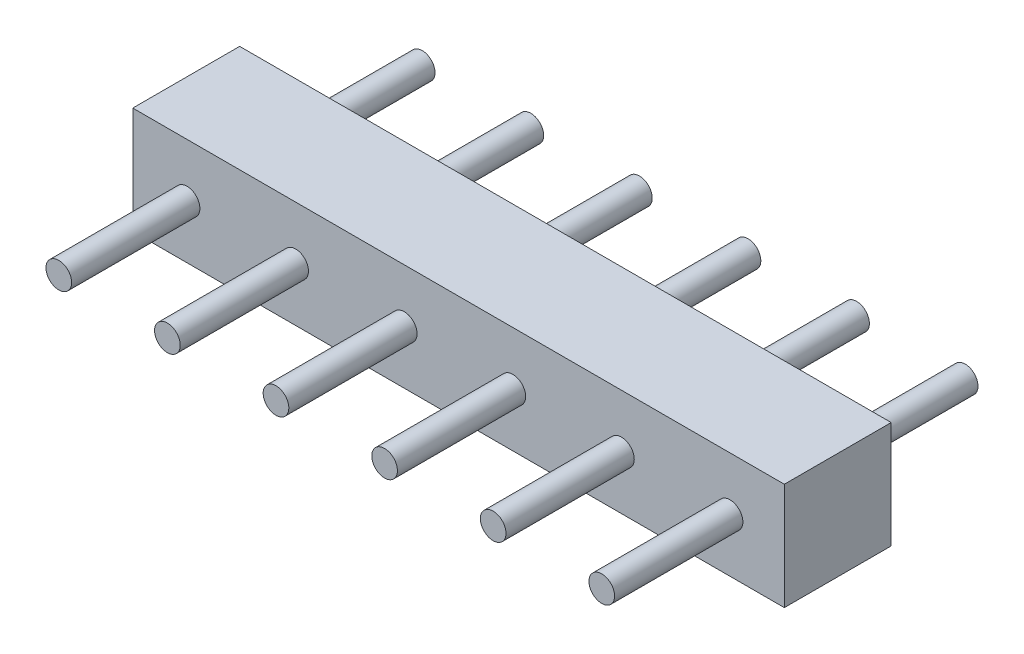
ISO-10303-21;
HEADER;
FILE_DESCRIPTION(('STEP AP214'),'2;1');
FILE_NAME('part.step','',(''),(''),'','','');
FILE_SCHEMA(('AUTOMOTIVE_DESIGN { 1 0 10303 214 1 1 1 1 }'));
ENDSEC;
DATA;
#1=APPLICATION_CONTEXT('core data for automotive mechanical design processes');
#2=APPLICATION_PROTOCOL_DEFINITION('international standard','automotive_design',2000,#1);
#3=PRODUCT_CONTEXT('',#1,'mechanical');
#4=PRODUCT('Part','Part','',(#3));
#5=PRODUCT_RELATED_PRODUCT_CATEGORY('part','',(#4));
#6=PRODUCT_DEFINITION_FORMATION('','',#4);
#7=PRODUCT_DEFINITION_CONTEXT('part definition',#1,'design');
#8=PRODUCT_DEFINITION('design','',#6,#7);
#9=PRODUCT_DEFINITION_SHAPE('','',#8);
#10=(LENGTH_UNIT() NAMED_UNIT(*) SI_UNIT(.MILLI.,.METRE.));
#11=(NAMED_UNIT(*) PLANE_ANGLE_UNIT() SI_UNIT($,.RADIAN.));
#12=(NAMED_UNIT(*) SI_UNIT($,.STERADIAN.) SOLID_ANGLE_UNIT());
#13=UNCERTAINTY_MEASURE_WITH_UNIT(LENGTH_MEASURE(1.E-05),#10,'distance_accuracy_value','');
#14=(GEOMETRIC_REPRESENTATION_CONTEXT(3) GLOBAL_UNCERTAINTY_ASSIGNED_CONTEXT((#13)) GLOBAL_UNIT_ASSIGNED_CONTEXT((#10,
#11,#12)) REPRESENTATION_CONTEXT('',''));
#15=CARTESIAN_POINT('',(0.,0.,0.));
#16=DIRECTION('',(0.,0.,1.));
#17=DIRECTION('',(1.,0.,0.));
#18=AXIS2_PLACEMENT_3D('',#15,#16,#17);
#19=CARTESIAN_POINT('',(0.,0.,2.5));
#20=DIRECTION('',(1.,0.,0.));
#21=DIRECTION('',(0.,0.,-1.));
#22=AXIS2_PLACEMENT_3D('',#19,#20,#21);
#23=PLANE('',#22);
#24=DIRECTION('',(0.,-1.,0.));
#25=VECTOR('',#24,1.);
#26=CARTESIAN_POINT('',(0.,0.,0.));
#27=LINE('',#26,#25);
#28=CARTESIAN_POINT('',(0.,2.5,0.));
#29=VERTEX_POINT('',#28);
#30=CARTESIAN_POINT('',(0.,0.,0.));
#31=VERTEX_POINT('',#30);
#32=EDGE_CURVE('E104',#29,#31,#27,.T.);
#33=ORIENTED_EDGE('',*,*,#32,.T.);
#34=DIRECTION('',(0.,0.,-1.));
#35=VECTOR('',#34,1.);
#36=CARTESIAN_POINT('',(0.,0.,2.5));
#37=LINE('',#36,#35);
#38=CARTESIAN_POINT('',(0.,0.,2.5));
#39=VERTEX_POINT('',#38);
#40=EDGE_CURVE('E95',#39,#31,#37,.T.);
#41=ORIENTED_EDGE('',*,*,#40,.F.);
#42=DIRECTION('',(0.,-1.,0.));
#43=VECTOR('',#42,1.);
#44=CARTESIAN_POINT('',(0.,0.,2.5));
#45=LINE('',#44,#43);
#46=CARTESIAN_POINT('',(0.,2.5,2.5));
#47=VERTEX_POINT('',#46);
#48=EDGE_CURVE('E89',#47,#39,#45,.T.);
#49=ORIENTED_EDGE('',*,*,#48,.F.);
#50=DIRECTION('',(0.,0.,-1.));
#51=VECTOR('',#50,1.);
#52=CARTESIAN_POINT('',(0.,2.5,2.5));
#53=LINE('',#52,#51);
#54=EDGE_CURVE('E100',#47,#29,#53,.T.);
#55=ORIENTED_EDGE('',*,*,#54,.T.);
#56=EDGE_LOOP('',(#33,#41,#49,#55));
#57=FACE_BOUND('',#56,.T.);
#58=ADVANCED_FACE('F37',(#57),#23,.F.);
#59=CARTESIAN_POINT('',(0.,0.,2.5));
#60=DIRECTION('',(0.,1.,0.));
#61=DIRECTION('',(0.,0.,1.));
#62=AXIS2_PLACEMENT_3D('',#59,#60,#61);
#63=PLANE('',#62);
#64=DIRECTION('',(1.,0.,0.));
#65=VECTOR('',#64,1.);
#66=CARTESIAN_POINT('',(0.,0.,0.));
#67=LINE('',#66,#65);
#68=CARTESIAN_POINT('',(15.24,0.,0.));
#69=VERTEX_POINT('',#68);
#70=EDGE_CURVE('E94',#31,#69,#67,.T.);
#71=ORIENTED_EDGE('',*,*,#70,.T.);
#72=DIRECTION('',(0.,0.,-1.));
#73=VECTOR('',#72,1.);
#74=CARTESIAN_POINT('',(15.24,0.,2.5));
#75=LINE('',#74,#73);
#76=CARTESIAN_POINT('',(15.24,0.,2.5));
#77=VERTEX_POINT('',#76);
#78=EDGE_CURVE('E92',#77,#69,#75,.T.);
#79=ORIENTED_EDGE('',*,*,#78,.F.);
#80=DIRECTION('',(1.,0.,0.));
#81=VECTOR('',#80,1.);
#82=CARTESIAN_POINT('',(0.,0.,2.5));
#83=LINE('',#82,#81);
#84=EDGE_CURVE('E84',#39,#77,#83,.T.);
#85=ORIENTED_EDGE('',*,*,#84,.F.);
#86=ORIENTED_EDGE('',*,*,#40,.T.);
#87=EDGE_LOOP('',(#71,#79,#85,#86));
#88=FACE_BOUND('',#87,.T.);
#89=ADVANCED_FACE('F93',(#88),#63,.F.);
#90=CARTESIAN_POINT('',(15.24,0.,2.5));
#91=DIRECTION('',(-1.,0.,0.));
#92=DIRECTION('',(0.,-1.,0.));
#93=AXIS2_PLACEMENT_3D('',#90,#91,#92);
#94=PLANE('',#93);
#95=DIRECTION('',(0.,1.,0.));
#96=VECTOR('',#95,1.);
#97=CARTESIAN_POINT('',(15.24,0.,0.));
#98=LINE('',#97,#96);
#99=CARTESIAN_POINT('',(15.24,2.5,0.));
#100=VERTEX_POINT('',#99);
#101=EDGE_CURVE('E70',#69,#100,#98,.T.);
#102=ORIENTED_EDGE('',*,*,#101,.T.);
#103=DIRECTION('',(0.,0.,-1.));
#104=VECTOR('',#103,1.);
#105=CARTESIAN_POINT('',(15.24,2.5,2.5));
#106=LINE('',#105,#104);
#107=CARTESIAN_POINT('',(15.24,2.5,2.5));
#108=VERTEX_POINT('',#107);
#109=EDGE_CURVE('E96',#108,#100,#106,.T.);
#110=ORIENTED_EDGE('',*,*,#109,.F.);
#111=DIRECTION('',(0.,1.,0.));
#112=VECTOR('',#111,1.);
#113=CARTESIAN_POINT('',(15.24,0.,2.5));
#114=LINE('',#113,#112);
#115=EDGE_CURVE('E87',#77,#108,#114,.T.);
#116=ORIENTED_EDGE('',*,*,#115,.F.);
#117=ORIENTED_EDGE('',*,*,#78,.T.);
#118=EDGE_LOOP('',(#102,#110,#116,#117));
#119=FACE_BOUND('',#118,.T.);
#120=ADVANCED_FACE('F98',(#119),#94,.F.);
#121=CARTESIAN_POINT('',(0.,2.5,2.5));
#122=DIRECTION('',(0.,-1.,0.));
#123=DIRECTION('',(0.,0.,-1.));
#124=AXIS2_PLACEMENT_3D('',#121,#122,#123);
#125=PLANE('',#124);
#126=DIRECTION('',(-1.,0.,0.));
#127=VECTOR('',#126,1.);
#128=CARTESIAN_POINT('',(0.,2.5,0.));
#129=LINE('',#128,#127);
#130=EDGE_CURVE('E76',#100,#29,#129,.T.);
#131=ORIENTED_EDGE('',*,*,#130,.T.);
#132=ORIENTED_EDGE('',*,*,#54,.F.);
#133=DIRECTION('',(-1.,0.,0.));
#134=VECTOR('',#133,1.);
#135=CARTESIAN_POINT('',(0.,2.5,2.5));
#136=LINE('',#135,#134);
#137=EDGE_CURVE('E53',#108,#47,#136,.T.);
#138=ORIENTED_EDGE('',*,*,#137,.F.);
#139=ORIENTED_EDGE('',*,*,#109,.T.);
#140=EDGE_LOOP('',(#131,#132,#138,#139));
#141=FACE_BOUND('',#140,.T.);
#142=ADVANCED_FACE('F147',(#141),#125,.F.);
#143=CARTESIAN_POINT('',(0.,0.,2.5));
#144=DIRECTION('',(0.,0.,-1.));
#145=DIRECTION('',(-1.,0.,0.));
#146=AXIS2_PLACEMENT_3D('',#143,#144,#145);
#147=PLANE('',#146);
#148=CARTESIAN_POINT('',(13.97,1.25,2.5));
#149=DIRECTION('',(0.,0.,-1.));
#150=DIRECTION('',(-1.,0.,0.));
#151=AXIS2_PLACEMENT_3D('',#148,#149,#150);
#152=CIRCLE('',#151,0.3);
#153=CARTESIAN_POINT('',(13.67,1.25,2.5));
#154=VERTEX_POINT('',#153);
#155=EDGE_CURVE('E424',#154,#154,#152,.T.);
#156=ORIENTED_EDGE('',*,*,#155,.T.);
#157=EDGE_LOOP('',(#156));
#158=FACE_BOUND('',#157,.T.);
#159=CARTESIAN_POINT('',(11.43,1.25,2.5));
#160=DIRECTION('',(0.,0.,-1.));
#161=DIRECTION('',(-1.,0.,0.));
#162=AXIS2_PLACEMENT_3D('',#159,#160,#161);
#163=CIRCLE('',#162,0.3);
#164=CARTESIAN_POINT('',(11.13,1.25,2.5));
#165=VERTEX_POINT('',#164);
#166=EDGE_CURVE('E435',#165,#165,#163,.T.);
#167=ORIENTED_EDGE('',*,*,#166,.T.);
#168=EDGE_LOOP('',(#167));
#169=FACE_BOUND('',#168,.T.);
#170=CARTESIAN_POINT('',(8.89,1.25,2.5));
#171=DIRECTION('',(0.,0.,-1.));
#172=DIRECTION('',(-1.,0.,0.));
#173=AXIS2_PLACEMENT_3D('',#170,#171,#172);
#174=CIRCLE('',#173,0.3);
#175=CARTESIAN_POINT('',(8.59,1.25,2.5));
#176=VERTEX_POINT('',#175);
#177=EDGE_CURVE('E444',#176,#176,#174,.T.);
#178=ORIENTED_EDGE('',*,*,#177,.T.);
#179=EDGE_LOOP('',(#178));
#180=FACE_BOUND('',#179,.T.);
#181=CARTESIAN_POINT('',(1.27,1.25,2.5));
#182=DIRECTION('',(0.,0.,-1.));
#183=DIRECTION('',(-1.,0.,0.));
#184=AXIS2_PLACEMENT_3D('',#181,#182,#183);
#185=CIRCLE('',#184,0.3);
#186=CARTESIAN_POINT('',(0.969999999999999,1.25,2.5));
#187=VERTEX_POINT('',#186);
#188=EDGE_CURVE('E453',#187,#187,#185,.T.);
#189=ORIENTED_EDGE('',*,*,#188,.T.);
#190=EDGE_LOOP('',(#189));
#191=FACE_BOUND('',#190,.T.);
#192=CARTESIAN_POINT('',(3.81,1.25,2.5));
#193=DIRECTION('',(0.,0.,-1.));
#194=DIRECTION('',(-1.,0.,0.));
#195=AXIS2_PLACEMENT_3D('',#192,#193,#194);
#196=CIRCLE('',#195,0.3);
#197=CARTESIAN_POINT('',(3.51,1.25,2.5));
#198=VERTEX_POINT('',#197);
#199=EDGE_CURVE('E462',#198,#198,#196,.T.);
#200=ORIENTED_EDGE('',*,*,#199,.T.);
#201=EDGE_LOOP('',(#200));
#202=FACE_BOUND('',#201,.T.);
#203=CARTESIAN_POINT('',(6.35,1.25,2.5));
#204=DIRECTION('',(0.,0.,-1.));
#205=DIRECTION('',(-1.,0.,0.));
#206=AXIS2_PLACEMENT_3D('',#203,#204,#205);
#207=CIRCLE('',#206,0.3);
#208=CARTESIAN_POINT('',(6.05,1.25,2.5));
#209=VERTEX_POINT('',#208);
#210=EDGE_CURVE('E107',#209,#209,#207,.T.);
#211=ORIENTED_EDGE('',*,*,#210,.T.);
#212=EDGE_LOOP('',(#211));
#213=FACE_BOUND('',#212,.T.);
#214=ORIENTED_EDGE('',*,*,#48,.T.);
#215=ORIENTED_EDGE('',*,*,#84,.T.);
#216=ORIENTED_EDGE('',*,*,#115,.T.);
#217=ORIENTED_EDGE('',*,*,#137,.T.);
#218=EDGE_LOOP('',(#214,#215,#216,#217));
#219=FACE_BOUND('',#218,.T.);
#220=ADVANCED_FACE('F85',(#158,#169,#180,#191,#202,#213,#219),#147,.F.);
#221=CARTESIAN_POINT('',(0.,0.,0.));
#222=DIRECTION('',(0.,0.,-1.));
#223=DIRECTION('',(-1.,0.,0.));
#224=AXIS2_PLACEMENT_3D('',#221,#222,#223);
#225=PLANE('',#224);
#226=CARTESIAN_POINT('',(13.97,1.25,0.));
#227=DIRECTION('',(0.,0.,-1.));
#228=DIRECTION('',(-1.,0.,0.));
#229=AXIS2_PLACEMENT_3D('',#226,#227,#228);
#230=CIRCLE('',#229,0.3);
#231=CARTESIAN_POINT('',(13.67,1.25,0.));
#232=VERTEX_POINT('',#231);
#233=EDGE_CURVE('E11',#232,#232,#230,.T.);
#234=ORIENTED_EDGE('',*,*,#233,.F.);
#235=EDGE_LOOP('',(#234));
#236=FACE_BOUND('',#235,.T.);
#237=CARTESIAN_POINT('',(11.43,1.25,0.));
#238=DIRECTION('',(0.,0.,-1.));
#239=DIRECTION('',(-1.,0.,0.));
#240=AXIS2_PLACEMENT_3D('',#237,#238,#239);
#241=CIRCLE('',#240,0.3);
#242=CARTESIAN_POINT('',(11.13,1.25,0.));
#243=VERTEX_POINT('',#242);
#244=EDGE_CURVE('E45',#243,#243,#241,.T.);
#245=ORIENTED_EDGE('',*,*,#244,.F.);
#246=EDGE_LOOP('',(#245));
#247=FACE_BOUND('',#246,.T.);
#248=CARTESIAN_POINT('',(8.89,1.25,0.));
#249=DIRECTION('',(0.,0.,-1.));
#250=DIRECTION('',(-1.,0.,0.));
#251=AXIS2_PLACEMENT_3D('',#248,#249,#250);
#252=CIRCLE('',#251,0.3);
#253=CARTESIAN_POINT('',(8.59,1.25,0.));
#254=VERTEX_POINT('',#253);
#255=EDGE_CURVE('E123',#254,#254,#252,.T.);
#256=ORIENTED_EDGE('',*,*,#255,.F.);
#257=EDGE_LOOP('',(#256));
#258=FACE_BOUND('',#257,.T.);
#259=CARTESIAN_POINT('',(1.27,1.25,0.));
#260=DIRECTION('',(0.,0.,-1.));
#261=DIRECTION('',(-1.,0.,0.));
#262=AXIS2_PLACEMENT_3D('',#259,#260,#261);
#263=CIRCLE('',#262,0.3);
#264=CARTESIAN_POINT('',(0.969999999999999,1.25,0.));
#265=VERTEX_POINT('',#264);
#266=EDGE_CURVE('E120',#265,#265,#263,.T.);
#267=ORIENTED_EDGE('',*,*,#266,.F.);
#268=EDGE_LOOP('',(#267));
#269=FACE_BOUND('',#268,.T.);
#270=CARTESIAN_POINT('',(3.81,1.25,0.));
#271=DIRECTION('',(0.,0.,-1.));
#272=DIRECTION('',(-1.,0.,0.));
#273=AXIS2_PLACEMENT_3D('',#270,#271,#272);
#274=CIRCLE('',#273,0.3);
#275=CARTESIAN_POINT('',(3.51,1.25,0.));
#276=VERTEX_POINT('',#275);
#277=EDGE_CURVE('E117',#276,#276,#274,.T.);
#278=ORIENTED_EDGE('',*,*,#277,.F.);
#279=EDGE_LOOP('',(#278));
#280=FACE_BOUND('',#279,.T.);
#281=CARTESIAN_POINT('',(6.35,1.25,0.));
#282=DIRECTION('',(0.,0.,-1.));
#283=DIRECTION('',(-1.,0.,0.));
#284=AXIS2_PLACEMENT_3D('',#281,#282,#283);
#285=CIRCLE('',#284,0.3);
#286=CARTESIAN_POINT('',(6.05,1.25,0.));
#287=VERTEX_POINT('',#286);
#288=EDGE_CURVE('E114',#287,#287,#285,.T.);
#289=ORIENTED_EDGE('',*,*,#288,.F.);
#290=EDGE_LOOP('',(#289));
#291=FACE_BOUND('',#290,.T.);
#292=ORIENTED_EDGE('',*,*,#32,.F.);
#293=ORIENTED_EDGE('',*,*,#130,.F.);
#294=ORIENTED_EDGE('',*,*,#101,.F.);
#295=ORIENTED_EDGE('',*,*,#70,.F.);
#296=EDGE_LOOP('',(#292,#293,#294,#295));
#297=FACE_BOUND('',#296,.T.);
#298=ADVANCED_FACE('F131',(#236,#247,#258,#269,#280,#291,#297),#225,.T.);
#299=CARTESIAN_POINT('',(6.35,1.25,-3.));
#300=DIRECTION('',(0.,0.,1.));
#301=DIRECTION('',(1.,0.,0.));
#302=AXIS2_PLACEMENT_3D('',#299,#300,#301);
#303=PLANE('',#302);
#304=CARTESIAN_POINT('',(6.35,1.25,-3.));
#305=DIRECTION('',(0.,0.,1.));
#306=DIRECTION('',(1.,0.,0.));
#307=AXIS2_PLACEMENT_3D('',#304,#305,#306);
#308=CIRCLE('',#307,0.3);
#309=CARTESIAN_POINT('',(6.65,1.25,-3.));
#310=VERTEX_POINT('',#309);
#311=EDGE_CURVE('E468',#310,#310,#308,.T.);
#312=ORIENTED_EDGE('',*,*,#311,.F.);
#313=EDGE_LOOP('',(#312));
#314=FACE_BOUND('',#313,.T.);
#315=ADVANCED_FACE('F134',(#314),#303,.F.);
#316=CARTESIAN_POINT('',(6.35,1.25,-3.));
#317=DIRECTION('',(0.,0.,1.));
#318=DIRECTION('',(1.,0.,0.));
#319=AXIS2_PLACEMENT_3D('',#316,#317,#318);
#320=CYLINDRICAL_SURFACE('',#319,0.3);
#321=ORIENTED_EDGE('',*,*,#288,.T.);
#322=EDGE_LOOP('',(#321));
#323=FACE_BOUND('',#322,.T.);
#324=ORIENTED_EDGE('',*,*,#311,.T.);
#325=EDGE_LOOP('',(#324));
#326=FACE_BOUND('',#325,.T.);
#327=ADVANCED_FACE('F181',(#323,#326),#320,.T.);
#328=CARTESIAN_POINT('',(6.35,1.25,5.5));
#329=DIRECTION('',(0.,0.,1.));
#330=DIRECTION('',(1.,0.,0.));
#331=AXIS2_PLACEMENT_3D('',#328,#329,#330);
#332=CIRCLE('',#331,0.3);
#333=CARTESIAN_POINT('',(6.65,1.25,5.5));
#334=VERTEX_POINT('',#333);
#335=EDGE_CURVE('E465',#334,#334,#332,.T.);
#336=ORIENTED_EDGE('',*,*,#335,.F.);
#337=EDGE_LOOP('',(#336));
#338=FACE_BOUND('',#337,.T.);
#339=ORIENTED_EDGE('',*,*,#210,.F.);
#340=EDGE_LOOP('',(#339));
#341=FACE_BOUND('',#340,.T.);
#342=ADVANCED_FACE('F192',(#338,#341),#320,.T.);
#343=CARTESIAN_POINT('',(6.35,1.25,5.5));
#344=DIRECTION('',(0.,0.,1.));
#345=DIRECTION('',(1.,0.,0.));
#346=AXIS2_PLACEMENT_3D('',#343,#344,#345);
#347=PLANE('',#346);
#348=ORIENTED_EDGE('',*,*,#335,.T.);
#349=EDGE_LOOP('',(#348));
#350=FACE_BOUND('',#349,.T.);
#351=ADVANCED_FACE('F202',(#350),#347,.T.);
#352=CARTESIAN_POINT('',(3.81,1.25,-3.));
#353=DIRECTION('',(0.,0.,1.));
#354=DIRECTION('',(1.,0.,0.));
#355=AXIS2_PLACEMENT_3D('',#352,#353,#354);
#356=PLANE('',#355);
#357=CARTESIAN_POINT('',(3.81,1.25,-3.));
#358=DIRECTION('',(0.,0.,1.));
#359=DIRECTION('',(1.,0.,0.));
#360=AXIS2_PLACEMENT_3D('',#357,#358,#359);
#361=CIRCLE('',#360,0.3);
#362=CARTESIAN_POINT('',(4.11,1.25,-3.));
#363=VERTEX_POINT('',#362);
#364=EDGE_CURVE('E459',#363,#363,#361,.T.);
#365=ORIENTED_EDGE('',*,*,#364,.F.);
#366=EDGE_LOOP('',(#365));
#367=FACE_BOUND('',#366,.T.);
#368=ADVANCED_FACE('F211',(#367),#356,.F.);
#369=CARTESIAN_POINT('',(3.81,1.25,-3.));
#370=DIRECTION('',(0.,0.,1.));
#371=DIRECTION('',(1.,0.,0.));
#372=AXIS2_PLACEMENT_3D('',#369,#370,#371);
#373=CYLINDRICAL_SURFACE('',#372,0.3);
#374=ORIENTED_EDGE('',*,*,#277,.T.);
#375=EDGE_LOOP('',(#374));
#376=FACE_BOUND('',#375,.T.);
#377=ORIENTED_EDGE('',*,*,#364,.T.);
#378=EDGE_LOOP('',(#377));
#379=FACE_BOUND('',#378,.T.);
#380=ADVANCED_FACE('F231',(#376,#379),#373,.T.);
#381=CARTESIAN_POINT('',(3.81,1.25,5.5));
#382=DIRECTION('',(0.,0.,1.));
#383=DIRECTION('',(1.,0.,0.));
#384=AXIS2_PLACEMENT_3D('',#381,#382,#383);
#385=CIRCLE('',#384,0.3);
#386=CARTESIAN_POINT('',(4.11,1.25,5.5));
#387=VERTEX_POINT('',#386);
#388=EDGE_CURVE('E456',#387,#387,#385,.T.);
#389=ORIENTED_EDGE('',*,*,#388,.F.);
#390=EDGE_LOOP('',(#389));
#391=FACE_BOUND('',#390,.T.);
#392=ORIENTED_EDGE('',*,*,#199,.F.);
#393=EDGE_LOOP('',(#392));
#394=FACE_BOUND('',#393,.T.);
#395=ADVANCED_FACE('F241',(#391,#394),#373,.T.);
#396=CARTESIAN_POINT('',(3.81,1.25,5.5));
#397=DIRECTION('',(0.,0.,1.));
#398=DIRECTION('',(1.,0.,0.));
#399=AXIS2_PLACEMENT_3D('',#396,#397,#398);
#400=PLANE('',#399);
#401=ORIENTED_EDGE('',*,*,#388,.T.);
#402=EDGE_LOOP('',(#401));
#403=FACE_BOUND('',#402,.T.);
#404=ADVANCED_FACE('F251',(#403),#400,.T.);
#405=CARTESIAN_POINT('',(1.27,1.25,-3.));
#406=DIRECTION('',(0.,0.,1.));
#407=DIRECTION('',(1.,0.,0.));
#408=AXIS2_PLACEMENT_3D('',#405,#406,#407);
#409=PLANE('',#408);
#410=CARTESIAN_POINT('',(1.27,1.25,-3.));
#411=DIRECTION('',(0.,0.,1.));
#412=DIRECTION('',(1.,0.,0.));
#413=AXIS2_PLACEMENT_3D('',#410,#411,#412);
#414=CIRCLE('',#413,0.3);
#415=CARTESIAN_POINT('',(1.57,1.25,-3.));
#416=VERTEX_POINT('',#415);
#417=EDGE_CURVE('E450',#416,#416,#414,.T.);
#418=ORIENTED_EDGE('',*,*,#417,.F.);
#419=EDGE_LOOP('',(#418));
#420=FACE_BOUND('',#419,.T.);
#421=ADVANCED_FACE('F260',(#420),#409,.F.);
#422=CARTESIAN_POINT('',(1.27,1.25,-3.));
#423=DIRECTION('',(0.,0.,1.));
#424=DIRECTION('',(1.,0.,0.));
#425=AXIS2_PLACEMENT_3D('',#422,#423,#424);
#426=CYLINDRICAL_SURFACE('',#425,0.3);
#427=ORIENTED_EDGE('',*,*,#266,.T.);
#428=EDGE_LOOP('',(#427));
#429=FACE_BOUND('',#428,.T.);
#430=ORIENTED_EDGE('',*,*,#417,.T.);
#431=EDGE_LOOP('',(#430));
#432=FACE_BOUND('',#431,.T.);
#433=ADVANCED_FACE('F270',(#429,#432),#426,.T.);
#434=CARTESIAN_POINT('',(1.27,1.25,5.5));
#435=DIRECTION('',(0.,0.,1.));
#436=DIRECTION('',(1.,0.,0.));
#437=AXIS2_PLACEMENT_3D('',#434,#435,#436);
#438=CIRCLE('',#437,0.3);
#439=CARTESIAN_POINT('',(1.57,1.25,5.5));
#440=VERTEX_POINT('',#439);
#441=EDGE_CURVE('E447',#440,#440,#438,.T.);
#442=ORIENTED_EDGE('',*,*,#441,.F.);
#443=EDGE_LOOP('',(#442));
#444=FACE_BOUND('',#443,.T.);
#445=ORIENTED_EDGE('',*,*,#188,.F.);
#446=EDGE_LOOP('',(#445));
#447=FACE_BOUND('',#446,.T.);
#448=ADVANCED_FACE('F280',(#444,#447),#426,.T.);
#449=CARTESIAN_POINT('',(1.27,1.25,5.5));
#450=DIRECTION('',(0.,0.,1.));
#451=DIRECTION('',(1.,0.,0.));
#452=AXIS2_PLACEMENT_3D('',#449,#450,#451);
#453=PLANE('',#452);
#454=ORIENTED_EDGE('',*,*,#441,.T.);
#455=EDGE_LOOP('',(#454));
#456=FACE_BOUND('',#455,.T.);
#457=ADVANCED_FACE('F290',(#456),#453,.T.);
#458=CARTESIAN_POINT('',(8.89,1.25,-3.));
#459=DIRECTION('',(0.,0.,1.));
#460=DIRECTION('',(1.,0.,0.));
#461=AXIS2_PLACEMENT_3D('',#458,#459,#460);
#462=PLANE('',#461);
#463=CARTESIAN_POINT('',(8.89,1.25,-3.));
#464=DIRECTION('',(0.,0.,1.));
#465=DIRECTION('',(1.,0.,0.));
#466=AXIS2_PLACEMENT_3D('',#463,#464,#465);
#467=CIRCLE('',#466,0.3);
#468=CARTESIAN_POINT('',(9.19,1.25,-3.));
#469=VERTEX_POINT('',#468);
#470=EDGE_CURVE('E441',#469,#469,#467,.T.);
#471=ORIENTED_EDGE('',*,*,#470,.F.);
#472=EDGE_LOOP('',(#471));
#473=FACE_BOUND('',#472,.T.);
#474=ADVANCED_FACE('F299',(#473),#462,.F.);
#475=CARTESIAN_POINT('',(8.89,1.25,-3.));
#476=DIRECTION('',(0.,0.,1.));
#477=DIRECTION('',(1.,0.,0.));
#478=AXIS2_PLACEMENT_3D('',#475,#476,#477);
#479=CYLINDRICAL_SURFACE('',#478,0.3);
#480=ORIENTED_EDGE('',*,*,#255,.T.);
#481=EDGE_LOOP('',(#480));
#482=FACE_BOUND('',#481,.T.);
#483=ORIENTED_EDGE('',*,*,#470,.T.);
#484=EDGE_LOOP('',(#483));
#485=FACE_BOUND('',#484,.T.);
#486=ADVANCED_FACE('F309',(#482,#485),#479,.T.);
#487=CARTESIAN_POINT('',(8.89,1.25,5.5));
#488=DIRECTION('',(0.,0.,1.));
#489=DIRECTION('',(1.,0.,0.));
#490=AXIS2_PLACEMENT_3D('',#487,#488,#489);
#491=CIRCLE('',#490,0.3);
#492=CARTESIAN_POINT('',(9.19,1.25,5.5));
#493=VERTEX_POINT('',#492);
#494=EDGE_CURVE('E438',#493,#493,#491,.T.);
#495=ORIENTED_EDGE('',*,*,#494,.F.);
#496=EDGE_LOOP('',(#495));
#497=FACE_BOUND('',#496,.T.);
#498=ORIENTED_EDGE('',*,*,#177,.F.);
#499=EDGE_LOOP('',(#498));
#500=FACE_BOUND('',#499,.T.);
#501=ADVANCED_FACE('F319',(#497,#500),#479,.T.);
#502=CARTESIAN_POINT('',(8.89,1.25,5.5));
#503=DIRECTION('',(0.,0.,1.));
#504=DIRECTION('',(1.,0.,0.));
#505=AXIS2_PLACEMENT_3D('',#502,#503,#504);
#506=PLANE('',#505);
#507=ORIENTED_EDGE('',*,*,#494,.T.);
#508=EDGE_LOOP('',(#507));
#509=FACE_BOUND('',#508,.T.);
#510=ADVANCED_FACE('F329',(#509),#506,.T.);
#511=CARTESIAN_POINT('',(11.43,1.25,-3.));
#512=DIRECTION('',(0.,0.,1.));
#513=DIRECTION('',(1.,0.,0.));
#514=AXIS2_PLACEMENT_3D('',#511,#512,#513);
#515=PLANE('',#514);
#516=CARTESIAN_POINT('',(11.43,1.25,-3.));
#517=DIRECTION('',(0.,0.,1.));
#518=DIRECTION('',(1.,0.,0.));
#519=AXIS2_PLACEMENT_3D('',#516,#517,#518);
#520=CIRCLE('',#519,0.3);
#521=CARTESIAN_POINT('',(11.73,1.25,-3.));
#522=VERTEX_POINT('',#521);
#523=EDGE_CURVE('E432',#522,#522,#520,.T.);
#524=ORIENTED_EDGE('',*,*,#523,.F.);
#525=EDGE_LOOP('',(#524));
#526=FACE_BOUND('',#525,.T.);
#527=ADVANCED_FACE('F338',(#526),#515,.F.);
#528=CARTESIAN_POINT('',(11.43,1.25,-3.));
#529=DIRECTION('',(0.,0.,1.));
#530=DIRECTION('',(1.,0.,0.));
#531=AXIS2_PLACEMENT_3D('',#528,#529,#530);
#532=CYLINDRICAL_SURFACE('',#531,0.3);
#533=ORIENTED_EDGE('',*,*,#244,.T.);
#534=EDGE_LOOP('',(#533));
#535=FACE_BOUND('',#534,.T.);
#536=ORIENTED_EDGE('',*,*,#523,.T.);
#537=EDGE_LOOP('',(#536));
#538=FACE_BOUND('',#537,.T.);
#539=ADVANCED_FACE('F128',(#535,#538),#532,.T.);
#540=CARTESIAN_POINT('',(11.43,1.25,5.5));
#541=DIRECTION('',(0.,0.,1.));
#542=DIRECTION('',(1.,0.,0.));
#543=AXIS2_PLACEMENT_3D('',#540,#541,#542);
#544=CIRCLE('',#543,0.3);
#545=CARTESIAN_POINT('',(11.73,1.25,5.5));
#546=VERTEX_POINT('',#545);
#547=EDGE_CURVE('E429',#546,#546,#544,.T.);
#548=ORIENTED_EDGE('',*,*,#547,.F.);
#549=EDGE_LOOP('',(#548));
#550=FACE_BOUND('',#549,.T.);
#551=ORIENTED_EDGE('',*,*,#166,.F.);
#552=EDGE_LOOP('',(#551));
#553=FACE_BOUND('',#552,.T.);
#554=ADVANCED_FACE('F357',(#550,#553),#532,.T.);
#555=CARTESIAN_POINT('',(11.43,1.25,5.5));
#556=DIRECTION('',(0.,0.,1.));
#557=DIRECTION('',(1.,0.,0.));
#558=AXIS2_PLACEMENT_3D('',#555,#556,#557);
#559=PLANE('',#558);
#560=ORIENTED_EDGE('',*,*,#547,.T.);
#561=EDGE_LOOP('',(#560));
#562=FACE_BOUND('',#561,.T.);
#563=ADVANCED_FACE('F366',(#562),#559,.T.);
#564=CARTESIAN_POINT('',(13.97,1.25,-3.));
#565=DIRECTION('',(0.,0.,1.));
#566=DIRECTION('',(1.,0.,0.));
#567=AXIS2_PLACEMENT_3D('',#564,#565,#566);
#568=PLANE('',#567);
#569=CARTESIAN_POINT('',(13.97,1.25,-3.));
#570=DIRECTION('',(0.,0.,1.));
#571=DIRECTION('',(1.,0.,0.));
#572=AXIS2_PLACEMENT_3D('',#569,#570,#571);
#573=CIRCLE('',#572,0.3);
#574=CARTESIAN_POINT('',(14.27,1.25,-3.));
#575=VERTEX_POINT('',#574);
#576=EDGE_CURVE('E421',#575,#575,#573,.T.);
#577=ORIENTED_EDGE('',*,*,#576,.F.);
#578=EDGE_LOOP('',(#577));
#579=FACE_BOUND('',#578,.T.);
#580=ADVANCED_FACE('F375',(#579),#568,.F.);
#581=CARTESIAN_POINT('',(13.97,1.25,-3.));
#582=DIRECTION('',(0.,0.,1.));
#583=DIRECTION('',(1.,0.,0.));
#584=AXIS2_PLACEMENT_3D('',#581,#582,#583);
#585=CYLINDRICAL_SURFACE('',#584,0.3);
#586=ORIENTED_EDGE('',*,*,#233,.T.);
#587=EDGE_LOOP('',(#586));
#588=FACE_BOUND('',#587,.T.);
#589=ORIENTED_EDGE('',*,*,#576,.T.);
#590=EDGE_LOOP('',(#589));
#591=FACE_BOUND('',#590,.T.);
#592=ADVANCED_FACE('F385',(#588,#591),#585,.T.);
#593=CARTESIAN_POINT('',(13.97,1.25,5.5));
#594=DIRECTION('',(0.,0.,1.));
#595=DIRECTION('',(1.,0.,0.));
#596=AXIS2_PLACEMENT_3D('',#593,#594,#595);
#597=CIRCLE('',#596,0.3);
#598=CARTESIAN_POINT('',(14.27,1.25,5.5));
#599=VERTEX_POINT('',#598);
#600=EDGE_CURVE('E420',#599,#599,#597,.T.);
#601=ORIENTED_EDGE('',*,*,#600,.F.);
#602=EDGE_LOOP('',(#601));
#603=FACE_BOUND('',#602,.T.);
#604=ORIENTED_EDGE('',*,*,#155,.F.);
#605=EDGE_LOOP('',(#604));
#606=FACE_BOUND('',#605,.T.);
#607=ADVANCED_FACE('F395',(#603,#606),#585,.T.);
#608=CARTESIAN_POINT('',(13.97,1.25,5.5));
#609=DIRECTION('',(0.,0.,1.));
#610=DIRECTION('',(1.,0.,0.));
#611=AXIS2_PLACEMENT_3D('',#608,#609,#610);
#612=PLANE('',#611);
#613=ORIENTED_EDGE('',*,*,#600,.T.);
#614=EDGE_LOOP('',(#613));
#615=FACE_BOUND('',#614,.T.);
#616=ADVANCED_FACE('F405',(#615),#612,.T.);
#617=CLOSED_SHELL('',(#58,#89,#120,#142,#220,#298,#315,#327,#342,#351,#368,#380,#395,#404,#421,
#433,#448,#457,#474,#486,#501,#510,#527,#539,#554,#563,#580,#592,#607,#616));
#618=MANIFOLD_SOLID_BREP('B2',#617);
#619=ADVANCED_BREP_SHAPE_REPRESENTATION('',(#18,#618),#14);
#620=SHAPE_DEFINITION_REPRESENTATION(#9,#619);
ENDSEC;
END-ISO-10303-21;
